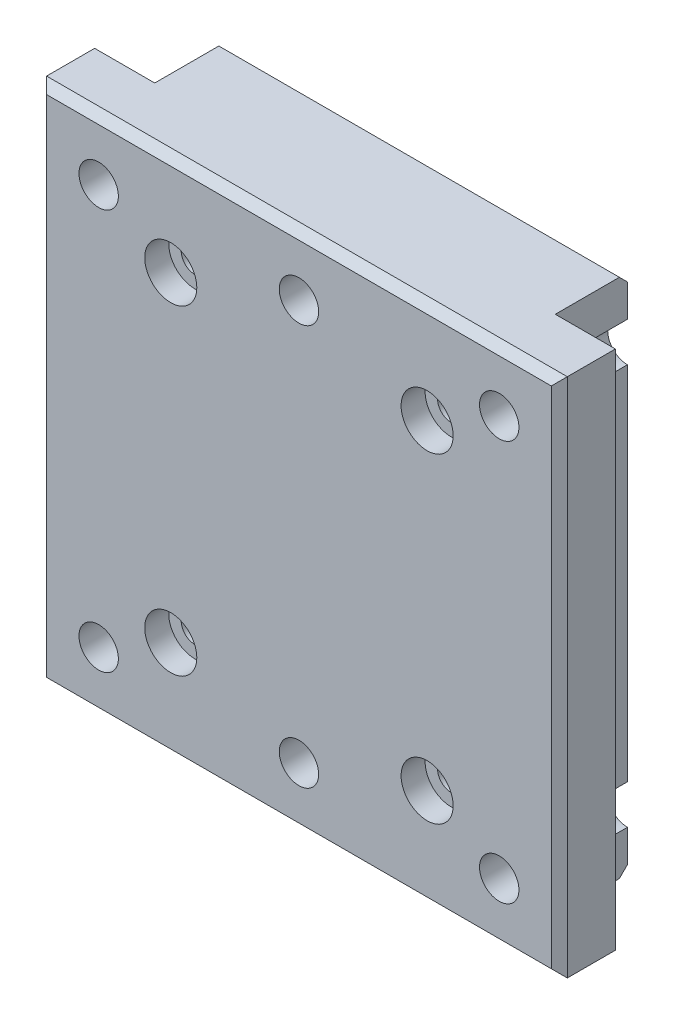
ISO-10303-21;
HEADER;
FILE_DESCRIPTION(('STEP AP214'),'2;1');
FILE_NAME('part.step','',(''),(''),'','','');
FILE_SCHEMA(('AUTOMOTIVE_DESIGN { 1 0 10303 214 1 1 1 1 }'));
ENDSEC;
DATA;
#1=APPLICATION_CONTEXT('core data for automotive mechanical design processes');
#2=APPLICATION_PROTOCOL_DEFINITION('international standard','automotive_design',2000,#1);
#3=PRODUCT_CONTEXT('',#1,'mechanical');
#4=PRODUCT('Part','Part','',(#3));
#5=PRODUCT_RELATED_PRODUCT_CATEGORY('part','',(#4));
#6=PRODUCT_DEFINITION_FORMATION('','',#4);
#7=PRODUCT_DEFINITION_CONTEXT('part definition',#1,'design');
#8=PRODUCT_DEFINITION('design','',#6,#7);
#9=PRODUCT_DEFINITION_SHAPE('','',#8);
#10=(LENGTH_UNIT() NAMED_UNIT(*) SI_UNIT(.MILLI.,.METRE.));
#11=(NAMED_UNIT(*) PLANE_ANGLE_UNIT() SI_UNIT($,.RADIAN.));
#12=(NAMED_UNIT(*) SI_UNIT($,.STERADIAN.) SOLID_ANGLE_UNIT());
#13=UNCERTAINTY_MEASURE_WITH_UNIT(LENGTH_MEASURE(1.E-05),#10,'distance_accuracy_value','');
#14=(GEOMETRIC_REPRESENTATION_CONTEXT(3) GLOBAL_UNCERTAINTY_ASSIGNED_CONTEXT((#13)) GLOBAL_UNIT_ASSIGNED_CONTEXT((#10,
#11,#12)) REPRESENTATION_CONTEXT('',''));
#15=CARTESIAN_POINT('',(0.,0.,0.));
#16=DIRECTION('',(0.,0.,1.));
#17=DIRECTION('',(1.,0.,0.));
#18=AXIS2_PLACEMENT_3D('',#15,#16,#17);
#19=CARTESIAN_POINT('',(57.5,65.,-8.30705400575444));
#20=DIRECTION('',(-1.,0.,0.));
#21=DIRECTION('',(0.,-1.,0.));
#22=AXIS2_PLACEMENT_3D('',#19,#20,#21);
#23=PLANE('',#22);
#24=DIRECTION('',(0.,0.,-1.));
#25=VECTOR('',#24,1.);
#26=CARTESIAN_POINT('',(57.5,5.0415,-77.305948363435));
#27=LINE('',#26,#25);
#28=CARTESIAN_POINT('',(57.5,5.0415,9.00000000000001));
#29=VERTEX_POINT('',#28);
#30=CARTESIAN_POINT('',(57.5,5.0415,0.));
#31=VERTEX_POINT('',#30);
#32=EDGE_CURVE('E34',#29,#31,#27,.T.);
#33=ORIENTED_EDGE('',*,*,#32,.F.);
#34=DIRECTION('',(0.,-1.,0.));
#35=VECTOR('',#34,1.);
#36=CARTESIAN_POINT('',(57.5,65.,9.00000000000001));
#37=LINE('',#36,#35);
#38=CARTESIAN_POINT('',(57.5,0.,9.00000000000001));
#39=VERTEX_POINT('',#38);
#40=EDGE_CURVE('E11',#29,#39,#37,.T.);
#41=ORIENTED_EDGE('',*,*,#40,.T.);
#42=DIRECTION('',(0.,0.,1.));
#43=VECTOR('',#42,1.);
#44=CARTESIAN_POINT('',(57.5,0.,-4.15352700287722));
#45=LINE('',#44,#43);
#46=CARTESIAN_POINT('',(57.5,0.,1.));
#47=VERTEX_POINT('',#46);
#48=EDGE_CURVE('E308',#47,#39,#45,.T.);
#49=ORIENTED_EDGE('',*,*,#48,.F.);
#50=DIRECTION('',(0.,-0.707106781186548,0.707106781186547));
#51=VECTOR('',#50,1.);
#52=CARTESIAN_POINT('',(57.5,18.8267635014386,-17.8267635014386));
#53=LINE('',#52,#51);
#54=CARTESIAN_POINT('',(57.5,1.,0.));
#55=VERTEX_POINT('',#54);
#56=EDGE_CURVE('E272',#55,#47,#53,.T.);
#57=ORIENTED_EDGE('',*,*,#56,.F.);
#58=DIRECTION('',(0.,-1.,0.));
#59=VECTOR('',#58,1.);
#60=CARTESIAN_POINT('',(57.5,48.75,0.));
#61=LINE('',#60,#59);
#62=EDGE_CURVE('E284',#31,#55,#61,.T.);
#63=ORIENTED_EDGE('',*,*,#62,.F.);
#64=EDGE_LOOP('',(#33,#41,#49,#57,#63));
#65=FACE_BOUND('',#64,.T.);
#66=ADVANCED_FACE('F16',(#65),#23,.F.);
#67=CARTESIAN_POINT('',(57.5,65.,-8.30705400575444));
#68=DIRECTION('',(-1.,0.,0.));
#69=DIRECTION('',(0.,-1.,0.));
#70=AXIS2_PLACEMENT_3D('',#67,#68,#69);
#71=PLANE('',#70);
#72=DIRECTION('',(0.,0.,1.));
#73=VECTOR('',#72,1.);
#74=CARTESIAN_POINT('',(57.5,59.9585,-77.305948363435));
#75=LINE('',#74,#73);
#76=CARTESIAN_POINT('',(57.5,59.9585,0.));
#77=VERTEX_POINT('',#76);
#78=CARTESIAN_POINT('',(57.5,59.9585,9.00000000000001));
#79=VERTEX_POINT('',#78);
#80=EDGE_CURVE('E490',#77,#79,#75,.T.);
#81=ORIENTED_EDGE('',*,*,#80,.F.);
#82=DIRECTION('',(0.,-1.,0.));
#83=VECTOR('',#82,1.);
#84=CARTESIAN_POINT('',(57.5,48.75,0.));
#85=LINE('',#84,#83);
#86=CARTESIAN_POINT('',(57.5,64.,0.));
#87=VERTEX_POINT('',#86);
#88=EDGE_CURVE('E267',#87,#77,#85,.T.);
#89=ORIENTED_EDGE('',*,*,#88,.F.);
#90=DIRECTION('',(0.,-0.707106781186543,-0.707106781186552));
#91=VECTOR('',#90,1.);
#92=CARTESIAN_POINT('',(57.5,62.4232364985614,-1.57676350143864));
#93=LINE('',#92,#91);
#94=CARTESIAN_POINT('',(57.5,65.,1.));
#95=VERTEX_POINT('',#94);
#96=EDGE_CURVE('E341',#95,#87,#93,.T.);
#97=ORIENTED_EDGE('',*,*,#96,.F.);
#98=DIRECTION('',(0.,0.,-1.));
#99=VECTOR('',#98,1.);
#100=CARTESIAN_POINT('',(57.5,65.,-4.15352700287722));
#101=LINE('',#100,#99);
#102=CARTESIAN_POINT('',(57.5,65.,9.00000000000001));
#103=VERTEX_POINT('',#102);
#104=EDGE_CURVE('E257',#103,#95,#101,.T.);
#105=ORIENTED_EDGE('',*,*,#104,.F.);
#106=DIRECTION('',(0.,-1.,0.));
#107=VECTOR('',#106,1.);
#108=CARTESIAN_POINT('',(57.5,65.,9.00000000000001));
#109=LINE('',#108,#107);
#110=EDGE_CURVE('E26',#103,#79,#109,.T.);
#111=ORIENTED_EDGE('',*,*,#110,.T.);
#112=EDGE_LOOP('',(#81,#89,#97,#105,#111));
#113=FACE_BOUND('',#112,.T.);
#114=ADVANCED_FACE('F389',(#113),#71,.F.);
#115=CARTESIAN_POINT('',(57.5,65.,-8.30705400575444));
#116=DIRECTION('',(-1.,0.,0.));
#117=DIRECTION('',(0.,-1.,0.));
#118=AXIS2_PLACEMENT_3D('',#115,#116,#117);
#119=PLANE('',#118);
#120=DIRECTION('',(0.,0.,-1.));
#121=VECTOR('',#120,1.);
#122=CARTESIAN_POINT('',(57.5,55.0415,-77.305948363435));
#123=LINE('',#122,#121);
#124=CARTESIAN_POINT('',(57.5,55.0415,9.00000000000001));
#125=VERTEX_POINT('',#124);
#126=CARTESIAN_POINT('',(57.5,55.0415,0.));
#127=VERTEX_POINT('',#126);
#128=EDGE_CURVE('E345',#125,#127,#123,.T.);
#129=ORIENTED_EDGE('',*,*,#128,.F.);
#130=DIRECTION('',(0.,-1.,0.));
#131=VECTOR('',#130,1.);
#132=CARTESIAN_POINT('',(57.5,65.,9.00000000000001));
#133=LINE('',#132,#131);
#134=CARTESIAN_POINT('',(57.5,9.9585,9.00000000000001));
#135=VERTEX_POINT('',#134);
#136=EDGE_CURVE('E478',#125,#135,#133,.T.);
#137=ORIENTED_EDGE('',*,*,#136,.T.);
#138=DIRECTION('',(0.,0.,1.));
#139=VECTOR('',#138,1.);
#140=CARTESIAN_POINT('',(57.5,9.9585,-77.305948363435));
#141=LINE('',#140,#139);
#142=CARTESIAN_POINT('',(57.5,9.9585,0.));
#143=VERTEX_POINT('',#142);
#144=EDGE_CURVE('E251',#143,#135,#141,.T.);
#145=ORIENTED_EDGE('',*,*,#144,.F.);
#146=DIRECTION('',(0.,-1.,0.));
#147=VECTOR('',#146,1.);
#148=CARTESIAN_POINT('',(57.5,48.75,0.));
#149=LINE('',#148,#147);
#150=EDGE_CURVE('E299',#127,#143,#149,.T.);
#151=ORIENTED_EDGE('',*,*,#150,.F.);
#152=EDGE_LOOP('',(#129,#137,#145,#151));
#153=FACE_BOUND('',#152,.T.);
#154=ADVANCED_FACE('F394',(#153),#119,.F.);
#155=CARTESIAN_POINT('',(57.5,65.,9.00000000000001));
#156=DIRECTION('',(0.,0.,1.));
#157=DIRECTION('',(1.,0.,0.));
#158=AXIS2_PLACEMENT_3D('',#155,#156,#157);
#159=PLANE('',#158);
#160=CARTESIAN_POINT('',(57.5,57.5,9.00000000000001));
#161=DIRECTION('',(0.,0.,-1.));
#162=DIRECTION('',(-1.,0.,0.));
#163=AXIS2_PLACEMENT_3D('',#160,#161,#162);
#164=CIRCLE('',#163,2.4585);
#165=EDGE_CURVE('E487',#79,#125,#164,.T.);
#166=ORIENTED_EDGE('',*,*,#165,.F.);
#167=ORIENTED_EDGE('',*,*,#110,.F.);
#168=DIRECTION('',(-1.,0.,0.));
#169=VECTOR('',#168,1.);
#170=CARTESIAN_POINT('',(28.75,65.,9.00000000000001));
#171=LINE('',#170,#169);
#172=CARTESIAN_POINT('',(65.,65.,9.));
#173=VERTEX_POINT('',#172);
#174=EDGE_CURVE('E356',#173,#103,#171,.T.);
#175=ORIENTED_EDGE('',*,*,#174,.F.);
#176=DIRECTION('',(0.,1.,0.));
#177=VECTOR('',#176,1.);
#178=CARTESIAN_POINT('',(65.,65.,9.));
#179=LINE('',#178,#177);
#180=CARTESIAN_POINT('',(65.,0.,9.));
#181=VERTEX_POINT('',#180);
#182=EDGE_CURVE('E350',#181,#173,#179,.T.);
#183=ORIENTED_EDGE('',*,*,#182,.F.);
#184=DIRECTION('',(1.,0.,0.));
#185=VECTOR('',#184,1.);
#186=CARTESIAN_POINT('',(61.25,0.,9.));
#187=LINE('',#186,#185);
#188=EDGE_CURVE('E312',#39,#181,#187,.T.);
#189=ORIENTED_EDGE('',*,*,#188,.F.);
#190=ORIENTED_EDGE('',*,*,#40,.F.);
#191=CARTESIAN_POINT('',(57.5,7.5,9.00000000000001));
#192=DIRECTION('',(0.,0.,-1.));
#193=DIRECTION('',(-1.,0.,0.));
#194=AXIS2_PLACEMENT_3D('',#191,#192,#193);
#195=CIRCLE('',#194,2.4585);
#196=EDGE_CURVE('E482',#135,#29,#195,.T.);
#197=ORIENTED_EDGE('',*,*,#196,.F.);
#198=ORIENTED_EDGE('',*,*,#136,.F.);
#199=EDGE_LOOP('',(#166,#167,#175,#183,#189,#190,#197,#198));
#200=FACE_BOUND('',#199,.T.);
#201=ADVANCED_FACE('F400',(#200),#159,.F.);
#202=CARTESIAN_POINT('',(-21.4087388922902,65.,9.00000000000001));
#203=DIRECTION('',(0.,0.,1.));
#204=DIRECTION('',(1.,0.,0.));
#205=AXIS2_PLACEMENT_3D('',#202,#203,#204);
#206=PLANE('',#205);
#207=CARTESIAN_POINT('',(7.5,7.5,9.00000000000001));
#208=DIRECTION('',(0.,0.,-1.));
#209=DIRECTION('',(-1.,0.,0.));
#210=AXIS2_PLACEMENT_3D('',#207,#208,#209);
#211=CIRCLE('',#210,2.4585);
#212=CARTESIAN_POINT('',(7.49999999999999,5.0415,9.00000000000001));
#213=VERTEX_POINT('',#212);
#214=CARTESIAN_POINT('',(7.49999999999999,9.9585,9.00000000000001));
#215=VERTEX_POINT('',#214);
#216=EDGE_CURVE('E271',#213,#215,#211,.T.);
#217=ORIENTED_EDGE('',*,*,#216,.F.);
#218=DIRECTION('',(0.,-1.,0.));
#219=VECTOR('',#218,1.);
#220=CARTESIAN_POINT('',(7.49999999999998,65.,9.));
#221=LINE('',#220,#219);
#222=CARTESIAN_POINT('',(7.49999999999999,0.,9.));
#223=VERTEX_POINT('',#222);
#224=EDGE_CURVE('E243',#213,#223,#221,.T.);
#225=ORIENTED_EDGE('',*,*,#224,.T.);
#226=DIRECTION('',(1.,0.,0.));
#227=VECTOR('',#226,1.);
#228=CARTESIAN_POINT('',(21.7956305538549,0.,8.99999999999999));
#229=LINE('',#228,#227);
#230=CARTESIAN_POINT('',(0.,0.,9.));
#231=VERTEX_POINT('',#230);
#232=EDGE_CURVE('E233',#231,#223,#229,.T.);
#233=ORIENTED_EDGE('',*,*,#232,.F.);
#234=DIRECTION('',(0.,-1.,0.));
#235=VECTOR('',#234,1.);
#236=CARTESIAN_POINT('',(0.,32.5,9.));
#237=LINE('',#236,#235);
#238=CARTESIAN_POINT('',(0.,65.,9.));
#239=VERTEX_POINT('',#238);
#240=EDGE_CURVE('E222',#239,#231,#237,.T.);
#241=ORIENTED_EDGE('',*,*,#240,.F.);
#242=DIRECTION('',(-1.,0.,0.));
#243=VECTOR('',#242,1.);
#244=CARTESIAN_POINT('',(-10.7043694461451,65.,9.));
#245=LINE('',#244,#243);
#246=CARTESIAN_POINT('',(7.49999999999998,65.,9.));
#247=VERTEX_POINT('',#246);
#248=EDGE_CURVE('E235',#247,#239,#245,.T.);
#249=ORIENTED_EDGE('',*,*,#248,.F.);
#250=DIRECTION('',(0.,-1.,0.));
#251=VECTOR('',#250,1.);
#252=CARTESIAN_POINT('',(7.49999999999998,65.,9.));
#253=LINE('',#252,#251);
#254=CARTESIAN_POINT('',(7.49999999999998,59.9585,9.00000000000001));
#255=VERTEX_POINT('',#254);
#256=EDGE_CURVE('E240',#247,#255,#253,.T.);
#257=ORIENTED_EDGE('',*,*,#256,.T.);
#258=CARTESIAN_POINT('',(7.49999999999998,57.5,9.00000000000001));
#259=DIRECTION('',(0.,0.,-1.));
#260=DIRECTION('',(-1.,0.,0.));
#261=AXIS2_PLACEMENT_3D('',#258,#259,#260);
#262=CIRCLE('',#261,2.4585);
#263=CARTESIAN_POINT('',(7.49999999999998,55.0415,9.00000000000001));
#264=VERTEX_POINT('',#263);
#265=EDGE_CURVE('E245',#264,#255,#262,.T.);
#266=ORIENTED_EDGE('',*,*,#265,.F.);
#267=DIRECTION('',(0.,-1.,0.));
#268=VECTOR('',#267,1.);
#269=CARTESIAN_POINT('',(7.49999999999998,65.,9.));
#270=LINE('',#269,#268);
#271=EDGE_CURVE('E244',#264,#215,#270,.T.);
#272=ORIENTED_EDGE('',*,*,#271,.T.);
#273=EDGE_LOOP('',(#217,#225,#233,#241,#249,#257,#266,#272));
#274=FACE_BOUND('',#273,.T.);
#275=ADVANCED_FACE('F404',(#274),#206,.F.);
#276=CARTESIAN_POINT('',(7.49999999999998,65.,9.));
#277=DIRECTION('',(1.,0.,0.));
#278=DIRECTION('',(0.,0.,-1.));
#279=AXIS2_PLACEMENT_3D('',#276,#277,#278);
#280=PLANE('',#279);
#281=DIRECTION('',(0.,0.,-1.));
#282=VECTOR('',#281,1.);
#283=CARTESIAN_POINT('',(7.49999999999995,59.9585,-77.305948363435));
#284=LINE('',#283,#282);
#285=CARTESIAN_POINT('',(7.49999999999998,59.9585,0.));
#286=VERTEX_POINT('',#285);
#287=EDGE_CURVE('E248',#255,#286,#284,.T.);
#288=ORIENTED_EDGE('',*,*,#287,.F.);
#289=ORIENTED_EDGE('',*,*,#256,.F.);
#290=DIRECTION('',(0.,0.,1.));
#291=VECTOR('',#290,1.);
#292=CARTESIAN_POINT('',(7.49999999999998,65.,4.5));
#293=LINE('',#292,#291);
#294=CARTESIAN_POINT('',(7.49999999999998,65.,0.999999999999998));
#295=VERTEX_POINT('',#294);
#296=EDGE_CURVE('E238',#295,#247,#293,.T.);
#297=ORIENTED_EDGE('',*,*,#296,.F.);
#298=DIRECTION('',(0.,0.707106781186543,0.707106781186552));
#299=VECTOR('',#298,1.);
#300=CARTESIAN_POINT('',(7.49999999999998,66.75,2.75000000000002));
#301=LINE('',#300,#299);
#302=CARTESIAN_POINT('',(7.49999999999998,64.,0.));
#303=VERTEX_POINT('',#302);
#304=EDGE_CURVE('E258',#303,#295,#301,.T.);
#305=ORIENTED_EDGE('',*,*,#304,.F.);
#306=DIRECTION('',(0.,1.,0.));
#307=VECTOR('',#306,1.);
#308=CARTESIAN_POINT('',(7.49999999999998,48.75,0.));
#309=LINE('',#308,#307);
#310=EDGE_CURVE('E263',#286,#303,#309,.T.);
#311=ORIENTED_EDGE('',*,*,#310,.F.);
#312=EDGE_LOOP('',(#288,#289,#297,#305,#311));
#313=FACE_BOUND('',#312,.T.);
#314=ADVANCED_FACE('F408',(#313),#280,.F.);
#315=CARTESIAN_POINT('',(7.49999999999998,65.,9.));
#316=DIRECTION('',(1.,0.,0.));
#317=DIRECTION('',(0.,0.,-1.));
#318=AXIS2_PLACEMENT_3D('',#315,#316,#317);
#319=PLANE('',#318);
#320=DIRECTION('',(0.,0.,-1.));
#321=VECTOR('',#320,1.);
#322=CARTESIAN_POINT('',(7.49999999999995,9.9585,-77.305948363435));
#323=LINE('',#322,#321);
#324=CARTESIAN_POINT('',(7.49999999999999,9.9585,0.));
#325=VERTEX_POINT('',#324);
#326=EDGE_CURVE('E268',#215,#325,#323,.T.);
#327=ORIENTED_EDGE('',*,*,#326,.F.);
#328=ORIENTED_EDGE('',*,*,#271,.F.);
#329=DIRECTION('',(0.,0.,1.));
#330=VECTOR('',#329,1.);
#331=CARTESIAN_POINT('',(7.49999999999995,55.0415,-77.305948363435));
#332=LINE('',#331,#330);
#333=CARTESIAN_POINT('',(7.49999999999998,55.0415,0.));
#334=VERTEX_POINT('',#333);
#335=EDGE_CURVE('E247',#334,#264,#332,.T.);
#336=ORIENTED_EDGE('',*,*,#335,.F.);
#337=DIRECTION('',(0.,1.,0.));
#338=VECTOR('',#337,1.);
#339=CARTESIAN_POINT('',(7.49999999999998,48.75,0.));
#340=LINE('',#339,#338);
#341=EDGE_CURVE('E276',#325,#334,#340,.T.);
#342=ORIENTED_EDGE('',*,*,#341,.F.);
#343=EDGE_LOOP('',(#327,#328,#336,#342));
#344=FACE_BOUND('',#343,.T.);
#345=ADVANCED_FACE('F412',(#344),#319,.F.);
#346=CARTESIAN_POINT('',(7.49999999999998,65.,9.));
#347=DIRECTION('',(1.,0.,0.));
#348=DIRECTION('',(0.,0.,-1.));
#349=AXIS2_PLACEMENT_3D('',#346,#347,#348);
#350=PLANE('',#349);
#351=DIRECTION('',(0.,0.,1.));
#352=VECTOR('',#351,1.);
#353=CARTESIAN_POINT('',(7.49999999999995,5.0415,-77.305948363435));
#354=LINE('',#353,#352);
#355=CARTESIAN_POINT('',(7.49999999999999,5.0415,0.));
#356=VERTEX_POINT('',#355);
#357=EDGE_CURVE('E279',#356,#213,#354,.T.);
#358=ORIENTED_EDGE('',*,*,#357,.F.);
#359=DIRECTION('',(0.,1.,0.));
#360=VECTOR('',#359,1.);
#361=CARTESIAN_POINT('',(7.49999999999998,48.75,0.));
#362=LINE('',#361,#360);
#363=CARTESIAN_POINT('',(7.49999999999999,1.,0.));
#364=VERTEX_POINT('',#363);
#365=EDGE_CURVE('E282',#364,#356,#362,.T.);
#366=ORIENTED_EDGE('',*,*,#365,.F.);
#367=DIRECTION('',(0.,0.707106781186548,-0.707106781186547));
#368=VECTOR('',#367,1.);
#369=CARTESIAN_POINT('',(7.49999999999998,14.5,-13.5));
#370=LINE('',#369,#368);
#371=CARTESIAN_POINT('',(7.49999999999999,0.,1.));
#372=VERTEX_POINT('',#371);
#373=EDGE_CURVE('E285',#372,#364,#370,.T.);
#374=ORIENTED_EDGE('',*,*,#373,.F.);
#375=DIRECTION('',(0.,0.,-1.));
#376=VECTOR('',#375,1.);
#377=CARTESIAN_POINT('',(7.49999999999999,0.,4.50000000000001));
#378=LINE('',#377,#376);
#379=EDGE_CURVE('E275',#223,#372,#378,.T.);
#380=ORIENTED_EDGE('',*,*,#379,.F.);
#381=ORIENTED_EDGE('',*,*,#224,.F.);
#382=EDGE_LOOP('',(#358,#366,#374,#380,#381));
#383=FACE_BOUND('',#382,.T.);
#384=ADVANCED_FACE('F416',(#383),#350,.F.);
#385=CARTESIAN_POINT('',(57.5,7.5,-77.305948363435));
#386=DIRECTION('',(0.,0.,1.));
#387=DIRECTION('',(1.,0.,0.));
#388=AXIS2_PLACEMENT_3D('',#385,#386,#387);
#389=CYLINDRICAL_SURFACE('',#388,2.4585);
#390=CARTESIAN_POINT('',(57.5,7.5,16.));
#391=DIRECTION('',(0.,0.,-1.));
#392=DIRECTION('',(0.,-1.,0.));
#393=AXIS2_PLACEMENT_3D('',#390,#391,#392);
#394=CIRCLE('',#393,2.4585);
#395=CARTESIAN_POINT('',(57.5,5.0415,16.));
#396=VERTEX_POINT('',#395);
#397=EDGE_CURVE('E291',#396,#396,#394,.T.);
#398=ORIENTED_EDGE('',*,*,#397,.F.);
#399=EDGE_LOOP('',(#398));
#400=FACE_BOUND('',#399,.T.);
#401=ORIENTED_EDGE('',*,*,#144,.T.);
#402=ORIENTED_EDGE('',*,*,#196,.T.);
#403=ORIENTED_EDGE('',*,*,#32,.T.);
#404=CARTESIAN_POINT('',(57.5,7.5,0.));
#405=DIRECTION('',(0.,0.,1.));
#406=DIRECTION('',(1.,0.,0.));
#407=AXIS2_PLACEMENT_3D('',#404,#405,#406);
#408=CIRCLE('',#407,2.4585);
#409=EDGE_CURVE('E296',#143,#31,#408,.T.);
#410=ORIENTED_EDGE('',*,*,#409,.F.);
#411=EDGE_LOOP('',(#401,#402,#403,#410));
#412=FACE_BOUND('',#411,.T.);
#413=ADVANCED_FACE('F420',(#400,#412),#389,.F.);
#414=CARTESIAN_POINT('',(7.5,7.5,-77.305948363435));
#415=DIRECTION('',(0.,0.,1.));
#416=DIRECTION('',(1.,0.,0.));
#417=AXIS2_PLACEMENT_3D('',#414,#415,#416);
#418=CYLINDRICAL_SURFACE('',#417,2.4585);
#419=CARTESIAN_POINT('',(7.5,7.5,16.));
#420=DIRECTION('',(0.,0.,-1.));
#421=DIRECTION('',(0.,-1.,0.));
#422=AXIS2_PLACEMENT_3D('',#419,#420,#421);
#423=CIRCLE('',#422,2.4585);
#424=CARTESIAN_POINT('',(7.5,5.0415,16.));
#425=VERTEX_POINT('',#424);
#426=EDGE_CURVE('E295',#425,#425,#423,.T.);
#427=ORIENTED_EDGE('',*,*,#426,.F.);
#428=EDGE_LOOP('',(#427));
#429=FACE_BOUND('',#428,.T.);
#430=ORIENTED_EDGE('',*,*,#357,.T.);
#431=ORIENTED_EDGE('',*,*,#216,.T.);
#432=ORIENTED_EDGE('',*,*,#326,.T.);
#433=CARTESIAN_POINT('',(7.5,7.5,0.));
#434=DIRECTION('',(0.,0.,1.));
#435=DIRECTION('',(1.,0.,0.));
#436=AXIS2_PLACEMENT_3D('',#433,#434,#435);
#437=CIRCLE('',#436,2.4585);
#438=EDGE_CURVE('E278',#356,#325,#437,.T.);
#439=ORIENTED_EDGE('',*,*,#438,.F.);
#440=EDGE_LOOP('',(#430,#431,#432,#439));
#441=FACE_BOUND('',#440,.T.);
#442=ADVANCED_FACE('F424',(#429,#441),#418,.F.);
#443=CARTESIAN_POINT('',(48.75,0.5,0.5));
#444=DIRECTION('',(0.,-0.707106781186547,-0.707106781186548));
#445=DIRECTION('',(0.,0.707106781186548,-0.707106781186547));
#446=AXIS2_PLACEMENT_3D('',#443,#444,#445);
#447=PLANE('',#446);
#448=ORIENTED_EDGE('',*,*,#56,.T.);
#449=DIRECTION('',(-1.,0.,0.));
#450=VECTOR('',#449,1.);
#451=CARTESIAN_POINT('',(48.75,0.,1.));
#452=LINE('',#451,#450);
#453=EDGE_CURVE('E288',#47,#372,#452,.T.);
#454=ORIENTED_EDGE('',*,*,#453,.T.);
#455=ORIENTED_EDGE('',*,*,#373,.T.);
#456=DIRECTION('',(1.,0.,0.));
#457=VECTOR('',#456,1.);
#458=CARTESIAN_POINT('',(48.75,1.,0.));
#459=LINE('',#458,#457);
#460=EDGE_CURVE('E289',#364,#55,#459,.T.);
#461=ORIENTED_EDGE('',*,*,#460,.T.);
#462=EDGE_LOOP('',(#448,#454,#455,#461));
#463=FACE_BOUND('',#462,.T.);
#464=ADVANCED_FACE('F428',(#463),#447,.T.);
#465=CARTESIAN_POINT('',(65.,0.,0.));
#466=DIRECTION('',(0.,-1.,0.));
#467=DIRECTION('',(0.,0.,-1.));
#468=AXIS2_PLACEMENT_3D('',#465,#466,#467);
#469=PLANE('',#468);
#470=ORIENTED_EDGE('',*,*,#48,.T.);
#471=ORIENTED_EDGE('',*,*,#188,.T.);
#472=DIRECTION('',(0.,0.,1.));
#473=VECTOR('',#472,1.);
#474=CARTESIAN_POINT('',(65.,0.,0.));
#475=LINE('',#474,#473);
#476=CARTESIAN_POINT('',(65.,0.,15.));
#477=VERTEX_POINT('',#476);
#478=EDGE_CURVE('E309',#181,#477,#475,.T.);
#479=ORIENTED_EDGE('',*,*,#478,.T.);
#480=DIRECTION('',(1.,0.,0.));
#481=VECTOR('',#480,1.);
#482=CARTESIAN_POINT('',(48.75,0.,15.));
#483=LINE('',#482,#481);
#484=CARTESIAN_POINT('',(0.,0.,15.));
#485=VERTEX_POINT('',#484);
#486=EDGE_CURVE('E313',#485,#477,#483,.T.);
#487=ORIENTED_EDGE('',*,*,#486,.F.);
#488=DIRECTION('',(0.,0.,1.));
#489=VECTOR('',#488,1.);
#490=CARTESIAN_POINT('',(0.,0.,0.));
#491=LINE('',#490,#489);
#492=EDGE_CURVE('E225',#231,#485,#491,.T.);
#493=ORIENTED_EDGE('',*,*,#492,.F.);
#494=ORIENTED_EDGE('',*,*,#232,.T.);
#495=ORIENTED_EDGE('',*,*,#379,.T.);
#496=ORIENTED_EDGE('',*,*,#453,.F.);
#497=EDGE_LOOP('',(#470,#471,#479,#487,#493,#494,#495,#496));
#498=FACE_BOUND('',#497,.T.);
#499=ADVANCED_FACE('F371',(#498),#469,.T.);
#500=CARTESIAN_POINT('',(7.49999999999998,57.5,-77.305948363435));
#501=DIRECTION('',(0.,0.,1.));
#502=DIRECTION('',(1.,0.,0.));
#503=AXIS2_PLACEMENT_3D('',#500,#501,#502);
#504=CYLINDRICAL_SURFACE('',#503,2.4585);
#505=CARTESIAN_POINT('',(7.49999999999998,57.5,16.));
#506=DIRECTION('',(0.,0.,-1.));
#507=DIRECTION('',(0.,-1.,0.));
#508=AXIS2_PLACEMENT_3D('',#505,#506,#507);
#509=CIRCLE('',#508,2.4585);
#510=CARTESIAN_POINT('',(7.49999999999998,55.0415,16.));
#511=VERTEX_POINT('',#510);
#512=EDGE_CURVE('E184',#511,#511,#509,.T.);
#513=ORIENTED_EDGE('',*,*,#512,.F.);
#514=EDGE_LOOP('',(#513));
#515=FACE_BOUND('',#514,.T.);
#516=ORIENTED_EDGE('',*,*,#335,.T.);
#517=ORIENTED_EDGE('',*,*,#265,.T.);
#518=ORIENTED_EDGE('',*,*,#287,.T.);
#519=CARTESIAN_POINT('',(7.49999999999998,57.5,0.));
#520=DIRECTION('',(0.,0.,1.));
#521=DIRECTION('',(1.,0.,0.));
#522=AXIS2_PLACEMENT_3D('',#519,#520,#521);
#523=CIRCLE('',#522,2.4585);
#524=EDGE_CURVE('E266',#334,#286,#523,.T.);
#525=ORIENTED_EDGE('',*,*,#524,.F.);
#526=EDGE_LOOP('',(#516,#517,#518,#525));
#527=FACE_BOUND('',#526,.T.);
#528=ADVANCED_FACE('F435',(#515,#527),#504,.F.);
#529=CARTESIAN_POINT('',(32.5,32.5,0.));
#530=DIRECTION('',(0.,0.,1.));
#531=DIRECTION('',(1.,0.,0.));
#532=AXIS2_PLACEMENT_3D('',#529,#530,#531);
#533=PLANE('',#532);
#534=CARTESIAN_POINT('',(48.5,12.5,0.));
#535=DIRECTION('',(0.,0.,1.));
#536=DIRECTION('',(1.,0.,0.));
#537=AXIS2_PLACEMENT_3D('',#534,#535,#536);
#538=CIRCLE('',#537,1.7);
#539=CARTESIAN_POINT('',(50.2,12.5,0.));
#540=VERTEX_POINT('',#539);
#541=EDGE_CURVE('E254',#540,#540,#538,.T.);
#542=ORIENTED_EDGE('',*,*,#541,.T.);
#543=EDGE_LOOP('',(#542));
#544=FACE_BOUND('',#543,.T.);
#545=CARTESIAN_POINT('',(48.5,52.5,0.));
#546=DIRECTION('',(0.,0.,1.));
#547=DIRECTION('',(1.,0.,0.));
#548=AXIS2_PLACEMENT_3D('',#545,#546,#547);
#549=CIRCLE('',#548,1.7);
#550=CARTESIAN_POINT('',(50.2,52.5,0.));
#551=VERTEX_POINT('',#550);
#552=EDGE_CURVE('E324',#551,#551,#549,.T.);
#553=ORIENTED_EDGE('',*,*,#552,.T.);
#554=EDGE_LOOP('',(#553));
#555=FACE_BOUND('',#554,.T.);
#556=CARTESIAN_POINT('',(16.5,52.5,0.));
#557=DIRECTION('',(0.,0.,1.));
#558=DIRECTION('',(1.,0.,0.));
#559=AXIS2_PLACEMENT_3D('',#556,#557,#558);
#560=CIRCLE('',#559,1.7);
#561=CARTESIAN_POINT('',(18.2,52.5,0.));
#562=VERTEX_POINT('',#561);
#563=EDGE_CURVE('E327',#562,#562,#560,.T.);
#564=ORIENTED_EDGE('',*,*,#563,.T.);
#565=EDGE_LOOP('',(#564));
#566=FACE_BOUND('',#565,.T.);
#567=CARTESIAN_POINT('',(16.5,12.5,0.));
#568=DIRECTION('',(0.,0.,1.));
#569=DIRECTION('',(1.,0.,0.));
#570=AXIS2_PLACEMENT_3D('',#567,#568,#569);
#571=CIRCLE('',#570,1.7);
#572=CARTESIAN_POINT('',(18.2,12.5,0.));
#573=VERTEX_POINT('',#572);
#574=EDGE_CURVE('E330',#573,#573,#571,.T.);
#575=ORIENTED_EDGE('',*,*,#574,.T.);
#576=EDGE_LOOP('',(#575));
#577=FACE_BOUND('',#576,.T.);
#578=CARTESIAN_POINT('',(32.5,57.5,0.));
#579=DIRECTION('',(0.,0.,1.));
#580=DIRECTION('',(1.,0.,0.));
#581=AXIS2_PLACEMENT_3D('',#578,#579,#580);
#582=CIRCLE('',#581,2.4585);
#583=CARTESIAN_POINT('',(34.9585,57.5,0.));
#584=VERTEX_POINT('',#583);
#585=EDGE_CURVE('E333',#584,#584,#582,.T.);
#586=ORIENTED_EDGE('',*,*,#585,.T.);
#587=EDGE_LOOP('',(#586));
#588=FACE_BOUND('',#587,.T.);
#589=CARTESIAN_POINT('',(32.5,7.50000000000001,0.));
#590=DIRECTION('',(0.,0.,1.));
#591=DIRECTION('',(1.,0.,0.));
#592=AXIS2_PLACEMENT_3D('',#589,#590,#591);
#593=CIRCLE('',#592,2.4585);
#594=CARTESIAN_POINT('',(34.9585,7.50000000000001,0.));
#595=VERTEX_POINT('',#594);
#596=EDGE_CURVE('E336',#595,#595,#593,.T.);
#597=ORIENTED_EDGE('',*,*,#596,.T.);
#598=EDGE_LOOP('',(#597));
#599=FACE_BOUND('',#598,.T.);
#600=ORIENTED_EDGE('',*,*,#150,.T.);
#601=ORIENTED_EDGE('',*,*,#409,.T.);
#602=ORIENTED_EDGE('',*,*,#62,.T.);
#603=ORIENTED_EDGE('',*,*,#460,.F.);
#604=ORIENTED_EDGE('',*,*,#365,.T.);
#605=ORIENTED_EDGE('',*,*,#438,.T.);
#606=ORIENTED_EDGE('',*,*,#341,.T.);
#607=ORIENTED_EDGE('',*,*,#524,.T.);
#608=ORIENTED_EDGE('',*,*,#310,.T.);
#609=DIRECTION('',(-1.,0.,0.));
#610=VECTOR('',#609,1.);
#611=CARTESIAN_POINT('',(16.25,64.,0.));
#612=LINE('',#611,#610);
#613=EDGE_CURVE('E261',#87,#303,#612,.T.);
#614=ORIENTED_EDGE('',*,*,#613,.F.);
#615=ORIENTED_EDGE('',*,*,#88,.T.);
#616=CARTESIAN_POINT('',(57.5,57.5,0.));
#617=DIRECTION('',(0.,0.,1.));
#618=DIRECTION('',(1.,0.,0.));
#619=AXIS2_PLACEMENT_3D('',#616,#617,#618);
#620=CIRCLE('',#619,2.4585);
#621=EDGE_CURVE('E342',#77,#127,#620,.T.);
#622=ORIENTED_EDGE('',*,*,#621,.T.);
#623=EDGE_LOOP('',(#600,#601,#602,#603,#604,#605,#606,#607,#608,#614,#615,#622));
#624=FACE_BOUND('',#623,.T.);
#625=ADVANCED_FACE('F438',(#544,#555,#566,#577,#588,#599,#624),#533,.F.);
#626=CARTESIAN_POINT('',(57.5,57.5,-77.305948363435));
#627=DIRECTION('',(0.,0.,1.));
#628=DIRECTION('',(1.,0.,0.));
#629=AXIS2_PLACEMENT_3D('',#626,#627,#628);
#630=CYLINDRICAL_SURFACE('',#629,2.4585);
#631=ORIENTED_EDGE('',*,*,#128,.T.);
#632=ORIENTED_EDGE('',*,*,#621,.F.);
#633=ORIENTED_EDGE('',*,*,#80,.T.);
#634=ORIENTED_EDGE('',*,*,#165,.T.);
#635=EDGE_LOOP('',(#631,#632,#633,#634));
#636=FACE_BOUND('',#635,.T.);
#637=CARTESIAN_POINT('',(57.5,57.5,16.));
#638=DIRECTION('',(0.,0.,-1.));
#639=DIRECTION('',(0.,-1.,0.));
#640=AXIS2_PLACEMENT_3D('',#637,#638,#639);
#641=CIRCLE('',#640,2.4585);
#642=CARTESIAN_POINT('',(57.5,55.0415,16.));
#643=VERTEX_POINT('',#642);
#644=EDGE_CURVE('E294',#643,#643,#641,.T.);
#645=ORIENTED_EDGE('',*,*,#644,.F.);
#646=EDGE_LOOP('',(#645));
#647=FACE_BOUND('',#646,.T.);
#648=ADVANCED_FACE('F442',(#636,#647),#630,.F.);
#649=CARTESIAN_POINT('',(16.25,64.5,0.5));
#650=DIRECTION('',(0.,0.707106781186552,-0.707106781186543));
#651=DIRECTION('',(0.,0.707106781186543,0.707106781186552));
#652=AXIS2_PLACEMENT_3D('',#649,#650,#651);
#653=PLANE('',#652);
#654=ORIENTED_EDGE('',*,*,#96,.T.);
#655=ORIENTED_EDGE('',*,*,#613,.T.);
#656=ORIENTED_EDGE('',*,*,#304,.T.);
#657=DIRECTION('',(1.,0.,0.));
#658=VECTOR('',#657,1.);
#659=CARTESIAN_POINT('',(16.25,65.,1.));
#660=LINE('',#659,#658);
#661=EDGE_CURVE('E262',#295,#95,#660,.T.);
#662=ORIENTED_EDGE('',*,*,#661,.T.);
#663=EDGE_LOOP('',(#654,#655,#656,#662));
#664=FACE_BOUND('',#663,.T.);
#665=ADVANCED_FACE('F446',(#664),#653,.T.);
#666=CARTESIAN_POINT('',(65.,65.,0.));
#667=DIRECTION('',(1.,0.,0.));
#668=DIRECTION('',(0.,1.,0.));
#669=AXIS2_PLACEMENT_3D('',#666,#667,#668);
#670=PLANE('',#669);
#671=ORIENTED_EDGE('',*,*,#182,.T.);
#672=DIRECTION('',(0.,0.,1.));
#673=VECTOR('',#672,1.);
#674=CARTESIAN_POINT('',(65.,65.,0.));
#675=LINE('',#674,#673);
#676=CARTESIAN_POINT('',(65.,65.,15.));
#677=VERTEX_POINT('',#676);
#678=EDGE_CURVE('E351',#173,#677,#675,.T.);
#679=ORIENTED_EDGE('',*,*,#678,.T.);
#680=DIRECTION('',(0.,1.,0.));
#681=VECTOR('',#680,1.);
#682=CARTESIAN_POINT('',(65.,48.75,15.));
#683=LINE('',#682,#681);
#684=EDGE_CURVE('E161',#477,#677,#683,.T.);
#685=ORIENTED_EDGE('',*,*,#684,.F.);
#686=ORIENTED_EDGE('',*,*,#478,.F.);
#687=EDGE_LOOP('',(#671,#679,#685,#686));
#688=FACE_BOUND('',#687,.T.);
#689=ADVANCED_FACE('F385',(#688),#670,.T.);
#690=CARTESIAN_POINT('',(0.,65.,0.));
#691=DIRECTION('',(0.,1.,0.));
#692=DIRECTION('',(-1.,0.,0.));
#693=AXIS2_PLACEMENT_3D('',#690,#691,#692);
#694=PLANE('',#693);
#695=ORIENTED_EDGE('',*,*,#104,.T.);
#696=ORIENTED_EDGE('',*,*,#661,.F.);
#697=ORIENTED_EDGE('',*,*,#296,.T.);
#698=ORIENTED_EDGE('',*,*,#248,.T.);
#699=DIRECTION('',(0.,0.,1.));
#700=VECTOR('',#699,1.);
#701=CARTESIAN_POINT('',(0.,65.,0.));
#702=LINE('',#701,#700);
#703=CARTESIAN_POINT('',(0.,65.,15.));
#704=VERTEX_POINT('',#703);
#705=EDGE_CURVE('E239',#239,#704,#702,.T.);
#706=ORIENTED_EDGE('',*,*,#705,.T.);
#707=DIRECTION('',(-1.,0.,0.));
#708=VECTOR('',#707,1.);
#709=CARTESIAN_POINT('',(16.25,65.,15.));
#710=LINE('',#709,#708);
#711=EDGE_CURVE('E164',#677,#704,#710,.T.);
#712=ORIENTED_EDGE('',*,*,#711,.F.);
#713=ORIENTED_EDGE('',*,*,#678,.F.);
#714=ORIENTED_EDGE('',*,*,#174,.T.);
#715=EDGE_LOOP('',(#695,#696,#697,#698,#706,#712,#713,#714));
#716=FACE_BOUND('',#715,.T.);
#717=ADVANCED_FACE('F377',(#716),#694,.T.);
#718=CARTESIAN_POINT('',(48.75,0.5,15.5));
#719=DIRECTION('',(0.,-0.707106781186548,0.707106781186548));
#720=DIRECTION('',(0.,-0.707106781186548,-0.707106781186548));
#721=AXIS2_PLACEMENT_3D('',#718,#719,#720);
#722=PLANE('',#721);
#723=DIRECTION('',(-1.,0.,0.));
#724=VECTOR('',#723,1.);
#725=CARTESIAN_POINT('',(48.75,1.,16.));
#726=LINE('',#725,#724);
#727=CARTESIAN_POINT('',(64.,1.,16.));
#728=VERTEX_POINT('',#727);
#729=CARTESIAN_POINT('',(1.,1.,16.));
#730=VERTEX_POINT('',#729);
#731=EDGE_CURVE('E175',#728,#730,#726,.T.);
#732=ORIENTED_EDGE('',*,*,#731,.T.);
#733=DIRECTION('',(-0.577350269189626,-0.577350269189626,-0.577350269189626));
#734=VECTOR('',#733,1.);
#735=CARTESIAN_POINT('',(1.,1.,16.));
#736=LINE('',#735,#734);
#737=EDGE_CURVE('E315',#730,#485,#736,.T.);
#738=ORIENTED_EDGE('',*,*,#737,.T.);
#739=ORIENTED_EDGE('',*,*,#486,.T.);
#740=DIRECTION('',(0.577350269189624,-0.577350269189627,-0.577350269189627));
#741=VECTOR('',#740,1.);
#742=CARTESIAN_POINT('',(64.,1.,16.));
#743=LINE('',#742,#741);
#744=EDGE_CURVE('E176',#728,#477,#743,.T.);
#745=ORIENTED_EDGE('',*,*,#744,.F.);
#746=EDGE_LOOP('',(#732,#738,#739,#745));
#747=FACE_BOUND('',#746,.T.);
#748=ADVANCED_FACE('F375',(#747),#722,.T.);
#749=CARTESIAN_POINT('',(0.499999999999996,16.25,15.5));
#750=DIRECTION('',(-0.707106781186547,0.,0.707106781186548));
#751=DIRECTION('',(0.707106781186548,0.,0.707106781186547));
#752=AXIS2_PLACEMENT_3D('',#749,#750,#751);
#753=PLANE('',#752);
#754=DIRECTION('',(0.,1.,0.));
#755=VECTOR('',#754,1.);
#756=CARTESIAN_POINT('',(0.999999999999997,16.25,16.));
#757=LINE('',#756,#755);
#758=CARTESIAN_POINT('',(0.999999999999981,64.,16.));
#759=VERTEX_POINT('',#758);
#760=EDGE_CURVE('E316',#730,#759,#757,.T.);
#761=ORIENTED_EDGE('',*,*,#760,.T.);
#762=DIRECTION('',(-0.577350269189628,0.577350269189621,-0.577350269189628));
#763=VECTOR('',#762,1.);
#764=CARTESIAN_POINT('',(0.999999999999981,64.,16.));
#765=LINE('',#764,#763);
#766=EDGE_CURVE('E150',#759,#704,#765,.T.);
#767=ORIENTED_EDGE('',*,*,#766,.T.);
#768=DIRECTION('',(0.,-1.,0.));
#769=VECTOR('',#768,1.);
#770=CARTESIAN_POINT('',(0.,16.25,15.));
#771=LINE('',#770,#769);
#772=EDGE_CURVE('E170',#704,#485,#771,.T.);
#773=ORIENTED_EDGE('',*,*,#772,.T.);
#774=ORIENTED_EDGE('',*,*,#737,.F.);
#775=EDGE_LOOP('',(#761,#767,#773,#774));
#776=FACE_BOUND('',#775,.T.);
#777=ADVANCED_FACE('F366',(#776),#753,.T.);
#778=CARTESIAN_POINT('',(16.25,64.5,15.5));
#779=DIRECTION('',(0.,0.707106781186552,0.707106781186543));
#780=DIRECTION('',(0.,-0.707106781186543,0.707106781186552));
#781=AXIS2_PLACEMENT_3D('',#778,#779,#780);
#782=PLANE('',#781);
#783=DIRECTION('',(1.,0.,0.));
#784=VECTOR('',#783,1.);
#785=CARTESIAN_POINT('',(16.25,64.,16.));
#786=LINE('',#785,#784);
#787=CARTESIAN_POINT('',(64.,64.,16.));
#788=VERTEX_POINT('',#787);
#789=EDGE_CURVE('E163',#759,#788,#786,.T.);
#790=ORIENTED_EDGE('',*,*,#789,.T.);
#791=DIRECTION('',(0.577350269189627,0.577350269189622,-0.577350269189629));
#792=VECTOR('',#791,1.);
#793=CARTESIAN_POINT('',(64.,64.,16.));
#794=LINE('',#793,#792);
#795=EDGE_CURVE('E156',#788,#677,#794,.T.);
#796=ORIENTED_EDGE('',*,*,#795,.T.);
#797=ORIENTED_EDGE('',*,*,#711,.T.);
#798=ORIENTED_EDGE('',*,*,#766,.F.);
#799=EDGE_LOOP('',(#790,#796,#797,#798));
#800=FACE_BOUND('',#799,.T.);
#801=ADVANCED_FACE('F167',(#800),#782,.T.);
#802=CARTESIAN_POINT('',(64.5,48.75,15.5));
#803=DIRECTION('',(0.707106781186549,0.,0.707106781186546));
#804=DIRECTION('',(0.707106781186546,0.,-0.707106781186549));
#805=AXIS2_PLACEMENT_3D('',#802,#803,#804);
#806=PLANE('',#805);
#807=DIRECTION('',(0.,-1.,0.));
#808=VECTOR('',#807,1.);
#809=CARTESIAN_POINT('',(64.,48.75,16.));
#810=LINE('',#809,#808);
#811=EDGE_CURVE('E160',#788,#728,#810,.T.);
#812=ORIENTED_EDGE('',*,*,#811,.T.);
#813=ORIENTED_EDGE('',*,*,#744,.T.);
#814=ORIENTED_EDGE('',*,*,#684,.T.);
#815=ORIENTED_EDGE('',*,*,#795,.F.);
#816=EDGE_LOOP('',(#812,#813,#814,#815));
#817=FACE_BOUND('',#816,.T.);
#818=ADVANCED_FACE('F157',(#817),#806,.T.);
#819=CARTESIAN_POINT('',(32.5,32.5,16.));
#820=DIRECTION('',(0.,0.,1.));
#821=DIRECTION('',(1.,0.,0.));
#822=AXIS2_PLACEMENT_3D('',#819,#820,#821);
#823=PLANE('',#822);
#824=ORIENTED_EDGE('',*,*,#644,.T.);
#825=EDGE_LOOP('',(#824));
#826=FACE_BOUND('',#825,.T.);
#827=ORIENTED_EDGE('',*,*,#397,.T.);
#828=EDGE_LOOP('',(#827));
#829=FACE_BOUND('',#828,.T.);
#830=ORIENTED_EDGE('',*,*,#426,.T.);
#831=EDGE_LOOP('',(#830));
#832=FACE_BOUND('',#831,.T.);
#833=ORIENTED_EDGE('',*,*,#512,.T.);
#834=EDGE_LOOP('',(#833));
#835=FACE_BOUND('',#834,.T.);
#836=CARTESIAN_POINT('',(32.5,7.50000000000001,16.));
#837=DIRECTION('',(0.,0.,-1.));
#838=DIRECTION('',(0.,-1.,0.));
#839=AXIS2_PLACEMENT_3D('',#836,#837,#838);
#840=CIRCLE('',#839,2.4585);
#841=CARTESIAN_POINT('',(32.5,5.0415,16.));
#842=VERTEX_POINT('',#841);
#843=EDGE_CURVE('E181',#842,#842,#840,.T.);
#844=ORIENTED_EDGE('',*,*,#843,.T.);
#845=EDGE_LOOP('',(#844));
#846=FACE_BOUND('',#845,.T.);
#847=CARTESIAN_POINT('',(32.5,57.5,16.));
#848=DIRECTION('',(0.,0.,-1.));
#849=DIRECTION('',(0.,-1.,0.));
#850=AXIS2_PLACEMENT_3D('',#847,#848,#849);
#851=CIRCLE('',#850,2.4585);
#852=CARTESIAN_POINT('',(32.5,55.0415,16.));
#853=VERTEX_POINT('',#852);
#854=EDGE_CURVE('E185',#853,#853,#851,.T.);
#855=ORIENTED_EDGE('',*,*,#854,.T.);
#856=EDGE_LOOP('',(#855));
#857=FACE_BOUND('',#856,.T.);
#858=CARTESIAN_POINT('',(16.5,12.5,16.));
#859=DIRECTION('',(0.,0.,-1.));
#860=DIRECTION('',(0.,-1.,0.));
#861=AXIS2_PLACEMENT_3D('',#858,#859,#860);
#862=CIRCLE('',#861,3.25);
#863=CARTESIAN_POINT('',(16.5,9.25,16.));
#864=VERTEX_POINT('',#863);
#865=EDGE_CURVE('E188',#864,#864,#862,.T.);
#866=ORIENTED_EDGE('',*,*,#865,.T.);
#867=EDGE_LOOP('',(#866));
#868=FACE_BOUND('',#867,.T.);
#869=CARTESIAN_POINT('',(16.5,52.5,16.));
#870=DIRECTION('',(0.,0.,-1.));
#871=DIRECTION('',(0.,-1.,0.));
#872=AXIS2_PLACEMENT_3D('',#869,#870,#871);
#873=CIRCLE('',#872,3.25);
#874=CARTESIAN_POINT('',(16.5,49.25,16.));
#875=VERTEX_POINT('',#874);
#876=EDGE_CURVE('E191',#875,#875,#873,.T.);
#877=ORIENTED_EDGE('',*,*,#876,.T.);
#878=EDGE_LOOP('',(#877));
#879=FACE_BOUND('',#878,.T.);
#880=CARTESIAN_POINT('',(48.5,52.5,16.));
#881=DIRECTION('',(0.,0.,-1.));
#882=DIRECTION('',(0.,-1.,0.));
#883=AXIS2_PLACEMENT_3D('',#880,#881,#882);
#884=CIRCLE('',#883,3.25);
#885=CARTESIAN_POINT('',(48.5,49.25,16.));
#886=VERTEX_POINT('',#885);
#887=EDGE_CURVE('E194',#886,#886,#884,.T.);
#888=ORIENTED_EDGE('',*,*,#887,.T.);
#889=EDGE_LOOP('',(#888));
#890=FACE_BOUND('',#889,.T.);
#891=CARTESIAN_POINT('',(48.5,12.5,16.));
#892=DIRECTION('',(0.,0.,-1.));
#893=DIRECTION('',(0.,-1.,0.));
#894=AXIS2_PLACEMENT_3D('',#891,#892,#893);
#895=CIRCLE('',#894,3.25);
#896=CARTESIAN_POINT('',(48.5,9.25,16.));
#897=VERTEX_POINT('',#896);
#898=EDGE_CURVE('E197',#897,#897,#895,.T.);
#899=ORIENTED_EDGE('',*,*,#898,.T.);
#900=EDGE_LOOP('',(#899));
#901=FACE_BOUND('',#900,.T.);
#902=ORIENTED_EDGE('',*,*,#731,.F.);
#903=ORIENTED_EDGE('',*,*,#811,.F.);
#904=ORIENTED_EDGE('',*,*,#789,.F.);
#905=ORIENTED_EDGE('',*,*,#760,.F.);
#906=EDGE_LOOP('',(#902,#903,#904,#905));
#907=FACE_BOUND('',#906,.T.);
#908=ADVANCED_FACE('F173',(#826,#829,#832,#835,#846,#857,#868,#879,#890,#901,#907),#823,.T.);
#909=CARTESIAN_POINT('',(48.5,12.5,13.));
#910=DIRECTION('',(0.,0.,-1.));
#911=DIRECTION('',(-1.,0.,0.));
#912=AXIS2_PLACEMENT_3D('',#909,#910,#911);
#913=PLANE('',#912);
#914=CARTESIAN_POINT('',(48.5,12.5,13.));
#915=DIRECTION('',(0.,0.,1.));
#916=DIRECTION('',(1.,0.,0.));
#917=AXIS2_PLACEMENT_3D('',#914,#915,#916);
#918=CIRCLE('',#917,3.25);
#919=CARTESIAN_POINT('',(51.75,12.5,13.));
#920=VERTEX_POINT('',#919);
#921=EDGE_CURVE('E200',#920,#920,#918,.T.);
#922=ORIENTED_EDGE('',*,*,#921,.T.);
#923=EDGE_LOOP('',(#922));
#924=FACE_BOUND('',#923,.T.);
#925=CARTESIAN_POINT('',(48.5,12.5,13.));
#926=DIRECTION('',(0.,0.,1.));
#927=DIRECTION('',(1.,0.,0.));
#928=AXIS2_PLACEMENT_3D('',#925,#926,#927);
#929=CIRCLE('',#928,1.7);
#930=CARTESIAN_POINT('',(50.2,12.5,13.));
#931=VERTEX_POINT('',#930);
#932=EDGE_CURVE('E203',#931,#931,#929,.T.);
#933=ORIENTED_EDGE('',*,*,#932,.F.);
#934=EDGE_LOOP('',(#933));
#935=FACE_BOUND('',#934,.T.);
#936=ADVANCED_FACE('F524',(#924,#935),#913,.F.);
#937=CARTESIAN_POINT('',(48.5,12.5,14.5));
#938=DIRECTION('',(0.,0.,1.));
#939=DIRECTION('',(1.,0.,0.));
#940=AXIS2_PLACEMENT_3D('',#937,#938,#939);
#941=CYLINDRICAL_SURFACE('',#940,3.25);
#942=ORIENTED_EDGE('',*,*,#898,.F.);
#943=EDGE_LOOP('',(#942));
#944=FACE_BOUND('',#943,.T.);
#945=ORIENTED_EDGE('',*,*,#921,.F.);
#946=EDGE_LOOP('',(#945));
#947=FACE_BOUND('',#946,.T.);
#948=ADVANCED_FACE('F544',(#944,#947),#941,.F.);
#949=CARTESIAN_POINT('',(48.5,12.5,-77.305948363435));
#950=DIRECTION('',(0.,0.,1.));
#951=DIRECTION('',(1.,0.,0.));
#952=AXIS2_PLACEMENT_3D('',#949,#950,#951);
#953=CYLINDRICAL_SURFACE('',#952,1.7);
#954=ORIENTED_EDGE('',*,*,#541,.F.);
#955=EDGE_LOOP('',(#954));
#956=FACE_BOUND('',#955,.T.);
#957=ORIENTED_EDGE('',*,*,#932,.T.);
#958=EDGE_LOOP('',(#957));
#959=FACE_BOUND('',#958,.T.);
#960=ADVANCED_FACE('F547',(#956,#959),#953,.F.);
#961=CARTESIAN_POINT('',(48.5,52.5,13.));
#962=DIRECTION('',(0.,0.,-1.));
#963=DIRECTION('',(-1.,0.,0.));
#964=AXIS2_PLACEMENT_3D('',#961,#962,#963);
#965=PLANE('',#964);
#966=CARTESIAN_POINT('',(48.5,52.5,13.));
#967=DIRECTION('',(0.,0.,1.));
#968=DIRECTION('',(1.,0.,0.));
#969=AXIS2_PLACEMENT_3D('',#966,#967,#968);
#970=CIRCLE('',#969,3.25);
#971=CARTESIAN_POINT('',(51.75,52.5,13.));
#972=VERTEX_POINT('',#971);
#973=EDGE_CURVE('E206',#972,#972,#970,.T.);
#974=ORIENTED_EDGE('',*,*,#973,.T.);
#975=EDGE_LOOP('',(#974));
#976=FACE_BOUND('',#975,.T.);
#977=CARTESIAN_POINT('',(48.5,52.5,13.));
#978=DIRECTION('',(0.,0.,1.));
#979=DIRECTION('',(1.,0.,0.));
#980=AXIS2_PLACEMENT_3D('',#977,#978,#979);
#981=CIRCLE('',#980,1.7);
#982=CARTESIAN_POINT('',(50.2,52.5,13.));
#983=VERTEX_POINT('',#982);
#984=EDGE_CURVE('E209',#983,#983,#981,.T.);
#985=ORIENTED_EDGE('',*,*,#984,.F.);
#986=EDGE_LOOP('',(#985));
#987=FACE_BOUND('',#986,.T.);
#988=ADVANCED_FACE('F557',(#976,#987),#965,.F.);
#989=CARTESIAN_POINT('',(48.5,52.5,14.5));
#990=DIRECTION('',(0.,0.,1.));
#991=DIRECTION('',(1.,0.,0.));
#992=AXIS2_PLACEMENT_3D('',#989,#990,#991);
#993=CYLINDRICAL_SURFACE('',#992,3.25);
#994=ORIENTED_EDGE('',*,*,#887,.F.);
#995=EDGE_LOOP('',(#994));
#996=FACE_BOUND('',#995,.T.);
#997=ORIENTED_EDGE('',*,*,#973,.F.);
#998=EDGE_LOOP('',(#997));
#999=FACE_BOUND('',#998,.T.);
#1000=ADVANCED_FACE('F563',(#996,#999),#993,.F.);
#1001=CARTESIAN_POINT('',(48.5,52.5,-77.305948363435));
#1002=DIRECTION('',(0.,0.,1.));
#1003=DIRECTION('',(1.,0.,0.));
#1004=AXIS2_PLACEMENT_3D('',#1001,#1002,#1003);
#1005=CYLINDRICAL_SURFACE('',#1004,1.7);
#1006=ORIENTED_EDGE('',*,*,#552,.F.);
#1007=EDGE_LOOP('',(#1006));
#1008=FACE_BOUND('',#1007,.T.);
#1009=ORIENTED_EDGE('',*,*,#984,.T.);
#1010=EDGE_LOOP('',(#1009));
#1011=FACE_BOUND('',#1010,.T.);
#1012=ADVANCED_FACE('F570',(#1008,#1011),#1005,.F.);
#1013=CARTESIAN_POINT('',(16.5,52.5,13.));
#1014=DIRECTION('',(0.,0.,-1.));
#1015=DIRECTION('',(-1.,0.,0.));
#1016=AXIS2_PLACEMENT_3D('',#1013,#1014,#1015);
#1017=PLANE('',#1016);
#1018=CARTESIAN_POINT('',(16.5,52.5,13.));
#1019=DIRECTION('',(0.,0.,1.));
#1020=DIRECTION('',(1.,0.,0.));
#1021=AXIS2_PLACEMENT_3D('',#1018,#1019,#1020);
#1022=CIRCLE('',#1021,3.25);
#1023=CARTESIAN_POINT('',(19.75,52.5,13.));
#1024=VERTEX_POINT('',#1023);
#1025=EDGE_CURVE('E212',#1024,#1024,#1022,.T.);
#1026=ORIENTED_EDGE('',*,*,#1025,.T.);
#1027=EDGE_LOOP('',(#1026));
#1028=FACE_BOUND('',#1027,.T.);
#1029=CARTESIAN_POINT('',(16.5,52.5,13.));
#1030=DIRECTION('',(0.,0.,1.));
#1031=DIRECTION('',(1.,0.,0.));
#1032=AXIS2_PLACEMENT_3D('',#1029,#1030,#1031);
#1033=CIRCLE('',#1032,1.7);
#1034=CARTESIAN_POINT('',(18.2,52.5,13.));
#1035=VERTEX_POINT('',#1034);
#1036=EDGE_CURVE('E215',#1035,#1035,#1033,.T.);
#1037=ORIENTED_EDGE('',*,*,#1036,.F.);
#1038=EDGE_LOOP('',(#1037));
#1039=FACE_BOUND('',#1038,.T.);
#1040=ADVANCED_FACE('F574',(#1028,#1039),#1017,.F.);
#1041=CARTESIAN_POINT('',(16.5,52.5,14.5));
#1042=DIRECTION('',(0.,0.,1.));
#1043=DIRECTION('',(1.,0.,0.));
#1044=AXIS2_PLACEMENT_3D('',#1041,#1042,#1043);
#1045=CYLINDRICAL_SURFACE('',#1044,3.25);
#1046=ORIENTED_EDGE('',*,*,#876,.F.);
#1047=EDGE_LOOP('',(#1046));
#1048=FACE_BOUND('',#1047,.T.);
#1049=ORIENTED_EDGE('',*,*,#1025,.F.);
#1050=EDGE_LOOP('',(#1049));
#1051=FACE_BOUND('',#1050,.T.);
#1052=ADVANCED_FACE('F576',(#1048,#1051),#1045,.F.);
#1053=CARTESIAN_POINT('',(16.5,52.5,-77.305948363435));
#1054=DIRECTION('',(0.,0.,1.));
#1055=DIRECTION('',(1.,0.,0.));
#1056=AXIS2_PLACEMENT_3D('',#1053,#1054,#1055);
#1057=CYLINDRICAL_SURFACE('',#1056,1.7);
#1058=ORIENTED_EDGE('',*,*,#563,.F.);
#1059=EDGE_LOOP('',(#1058));
#1060=FACE_BOUND('',#1059,.T.);
#1061=ORIENTED_EDGE('',*,*,#1036,.T.);
#1062=EDGE_LOOP('',(#1061));
#1063=FACE_BOUND('',#1062,.T.);
#1064=ADVANCED_FACE('F579',(#1060,#1063),#1057,.F.);
#1065=CARTESIAN_POINT('',(16.5,12.5,13.));
#1066=DIRECTION('',(0.,0.,-1.));
#1067=DIRECTION('',(-1.,0.,0.));
#1068=AXIS2_PLACEMENT_3D('',#1065,#1066,#1067);
#1069=PLANE('',#1068);
#1070=CARTESIAN_POINT('',(16.5,12.5,13.));
#1071=DIRECTION('',(0.,0.,1.));
#1072=DIRECTION('',(1.,0.,0.));
#1073=AXIS2_PLACEMENT_3D('',#1070,#1071,#1072);
#1074=CIRCLE('',#1073,3.25);
#1075=CARTESIAN_POINT('',(19.75,12.5,13.));
#1076=VERTEX_POINT('',#1075);
#1077=EDGE_CURVE('E217',#1076,#1076,#1074,.T.);
#1078=ORIENTED_EDGE('',*,*,#1077,.T.);
#1079=EDGE_LOOP('',(#1078));
#1080=FACE_BOUND('',#1079,.T.);
#1081=CARTESIAN_POINT('',(16.5,12.5,13.));
#1082=DIRECTION('',(0.,0.,1.));
#1083=DIRECTION('',(1.,0.,0.));
#1084=AXIS2_PLACEMENT_3D('',#1081,#1082,#1083);
#1085=CIRCLE('',#1084,1.7);
#1086=CARTESIAN_POINT('',(18.2,12.5,13.));
#1087=VERTEX_POINT('',#1086);
#1088=EDGE_CURVE('E20',#1087,#1087,#1085,.T.);
#1089=ORIENTED_EDGE('',*,*,#1088,.F.);
#1090=EDGE_LOOP('',(#1089));
#1091=FACE_BOUND('',#1090,.T.);
#1092=ADVANCED_FACE('F18',(#1080,#1091),#1069,.F.);
#1093=CARTESIAN_POINT('',(16.5,12.5,14.5));
#1094=DIRECTION('',(0.,0.,1.));
#1095=DIRECTION('',(1.,0.,0.));
#1096=AXIS2_PLACEMENT_3D('',#1093,#1094,#1095);
#1097=CYLINDRICAL_SURFACE('',#1096,3.25);
#1098=ORIENTED_EDGE('',*,*,#865,.F.);
#1099=EDGE_LOOP('',(#1098));
#1100=FACE_BOUND('',#1099,.T.);
#1101=ORIENTED_EDGE('',*,*,#1077,.F.);
#1102=EDGE_LOOP('',(#1101));
#1103=FACE_BOUND('',#1102,.T.);
#1104=ADVANCED_FACE('F584',(#1100,#1103),#1097,.F.);
#1105=CARTESIAN_POINT('',(16.5,12.5,-77.305948363435));
#1106=DIRECTION('',(0.,0.,1.));
#1107=DIRECTION('',(1.,0.,0.));
#1108=AXIS2_PLACEMENT_3D('',#1105,#1106,#1107);
#1109=CYLINDRICAL_SURFACE('',#1108,1.7);
#1110=ORIENTED_EDGE('',*,*,#574,.F.);
#1111=EDGE_LOOP('',(#1110));
#1112=FACE_BOUND('',#1111,.T.);
#1113=ORIENTED_EDGE('',*,*,#1088,.T.);
#1114=EDGE_LOOP('',(#1113));
#1115=FACE_BOUND('',#1114,.T.);
#1116=ADVANCED_FACE('F587',(#1112,#1115),#1109,.F.);
#1117=CARTESIAN_POINT('',(32.5,57.5,-77.305948363435));
#1118=DIRECTION('',(0.,0.,1.));
#1119=DIRECTION('',(1.,0.,0.));
#1120=AXIS2_PLACEMENT_3D('',#1117,#1118,#1119);
#1121=CYLINDRICAL_SURFACE('',#1120,2.4585);
#1122=ORIENTED_EDGE('',*,*,#585,.F.);
#1123=EDGE_LOOP('',(#1122));
#1124=FACE_BOUND('',#1123,.T.);
#1125=ORIENTED_EDGE('',*,*,#854,.F.);
#1126=EDGE_LOOP('',(#1125));
#1127=FACE_BOUND('',#1126,.T.);
#1128=ADVANCED_FACE('F591',(#1124,#1127),#1121,.F.);
#1129=CARTESIAN_POINT('',(32.5,7.50000000000001,-77.305948363435));
#1130=DIRECTION('',(0.,0.,1.));
#1131=DIRECTION('',(1.,0.,0.));
#1132=AXIS2_PLACEMENT_3D('',#1129,#1130,#1131);
#1133=CYLINDRICAL_SURFACE('',#1132,2.4585);
#1134=ORIENTED_EDGE('',*,*,#596,.F.);
#1135=EDGE_LOOP('',(#1134));
#1136=FACE_BOUND('',#1135,.T.);
#1137=ORIENTED_EDGE('',*,*,#843,.F.);
#1138=EDGE_LOOP('',(#1137));
#1139=FACE_BOUND('',#1138,.T.);
#1140=ADVANCED_FACE('F595',(#1136,#1139),#1133,.F.);
#1141=CARTESIAN_POINT('',(0.,0.,0.));
#1142=DIRECTION('',(-1.,0.,0.));
#1143=DIRECTION('',(0.,-1.,0.));
#1144=AXIS2_PLACEMENT_3D('',#1141,#1142,#1143);
#1145=PLANE('',#1144);
#1146=ORIENTED_EDGE('',*,*,#240,.T.);
#1147=ORIENTED_EDGE('',*,*,#492,.T.);
#1148=ORIENTED_EDGE('',*,*,#772,.F.);
#1149=ORIENTED_EDGE('',*,*,#705,.F.);
#1150=EDGE_LOOP('',(#1146,#1147,#1148,#1149));
#1151=FACE_BOUND('',#1150,.T.);
#1152=ADVANCED_FACE('F367',(#1151),#1145,.T.);
#1153=CLOSED_SHELL('',(#66,#114,#154,#201,#275,#314,#345,#384,#413,#442,#464,#499,#528,#625,
#648,#665,#689,#717,#748,#777,#801,#818,#908,#936,#948,#960,#988,#1000,#1012,#1040,#1052,#1064,
#1092,#1104,#1116,#1128,#1140,#1152));
#1154=MANIFOLD_SOLID_BREP('B1',#1153);
#1155=ADVANCED_BREP_SHAPE_REPRESENTATION('',(#18,#1154),#14);
#1156=SHAPE_DEFINITION_REPRESENTATION(#9,#1155);
ENDSEC;
END-ISO-10303-21;
